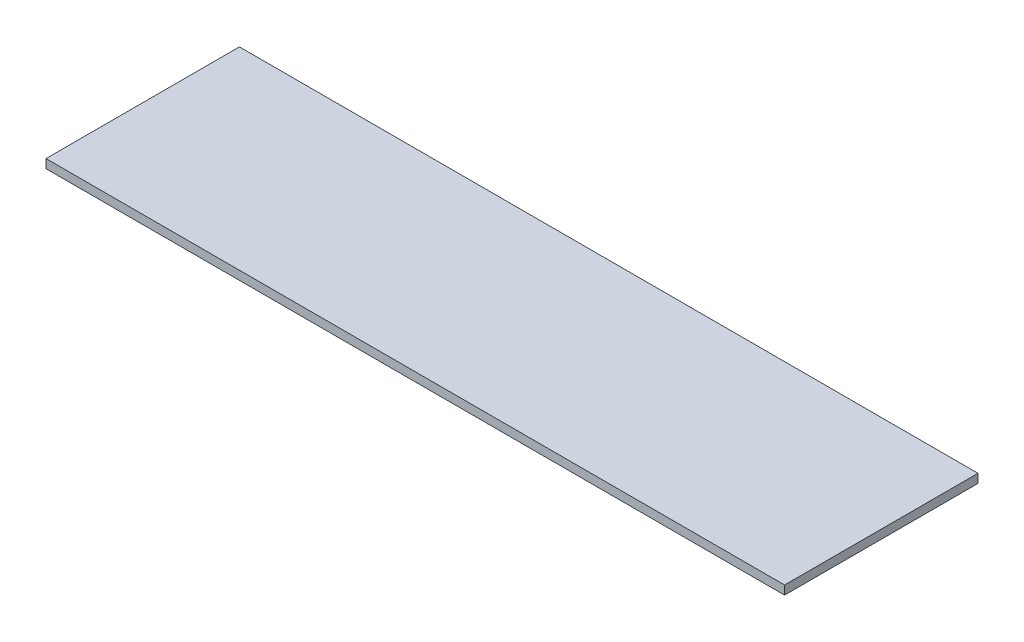
ISO-10303-21;
HEADER;
FILE_DESCRIPTION(('STEP AP214'),'2;1');
FILE_NAME('part.step','',(''),(''),'','','');
FILE_SCHEMA(('AUTOMOTIVE_DESIGN { 1 0 10303 214 1 1 1 1 }'));
ENDSEC;
DATA;
#1=APPLICATION_CONTEXT('core data for automotive mechanical design processes');
#2=APPLICATION_PROTOCOL_DEFINITION('international standard','automotive_design',2000,#1);
#3=PRODUCT_CONTEXT('',#1,'mechanical');
#4=PRODUCT('Part','Part','',(#3));
#5=PRODUCT_RELATED_PRODUCT_CATEGORY('part','',(#4));
#6=PRODUCT_DEFINITION_FORMATION('','',#4);
#7=PRODUCT_DEFINITION_CONTEXT('part definition',#1,'design');
#8=PRODUCT_DEFINITION('design','',#6,#7);
#9=PRODUCT_DEFINITION_SHAPE('','',#8);
#10=(LENGTH_UNIT() NAMED_UNIT(*) SI_UNIT(.MILLI.,.METRE.));
#11=(NAMED_UNIT(*) PLANE_ANGLE_UNIT() SI_UNIT($,.RADIAN.));
#12=(NAMED_UNIT(*) SI_UNIT($,.STERADIAN.) SOLID_ANGLE_UNIT());
#13=UNCERTAINTY_MEASURE_WITH_UNIT(LENGTH_MEASURE(1.E-05),#10,'distance_accuracy_value','');
#14=(GEOMETRIC_REPRESENTATION_CONTEXT(3) GLOBAL_UNCERTAINTY_ASSIGNED_CONTEXT((#13)) GLOBAL_UNIT_ASSIGNED_CONTEXT((#10,
#11,#12)) REPRESENTATION_CONTEXT('',''));
#15=CARTESIAN_POINT('',(0.,0.,0.));
#16=DIRECTION('',(0.,0.,1.));
#17=DIRECTION('',(1.,0.,0.));
#18=AXIS2_PLACEMENT_3D('',#15,#16,#17);
#19=CARTESIAN_POINT('',(0.,1.5875,-34.925));
#20=DIRECTION('',(1.,0.,0.));
#21=DIRECTION('',(0.,0.,-1.));
#22=AXIS2_PLACEMENT_3D('',#19,#20,#21);
#23=PLANE('',#22);
#24=DIRECTION('',(0.,0.,1.));
#25=VECTOR('',#24,1.);
#26=CARTESIAN_POINT('',(0.,0.,-34.925));
#27=LINE('',#26,#25);
#28=CARTESIAN_POINT('',(0.,0.,-34.925));
#29=VERTEX_POINT('',#28);
#30=CARTESIAN_POINT('',(0.,0.,0.));
#31=VERTEX_POINT('',#30);
#32=EDGE_CURVE('E105',#29,#31,#27,.T.);
#33=ORIENTED_EDGE('',*,*,#32,.T.);
#34=DIRECTION('',(0.,-1.,0.));
#35=VECTOR('',#34,1.);
#36=CARTESIAN_POINT('',(0.,1.5875,0.));
#37=LINE('',#36,#35);
#38=CARTESIAN_POINT('',(0.,1.5875,0.));
#39=VERTEX_POINT('',#38);
#40=EDGE_CURVE('E11',#39,#31,#37,.T.);
#41=ORIENTED_EDGE('',*,*,#40,.F.);
#42=DIRECTION('',(0.,0.,1.));
#43=VECTOR('',#42,1.);
#44=CARTESIAN_POINT('',(0.,1.5875,-34.925));
#45=LINE('',#44,#43);
#46=CARTESIAN_POINT('',(0.,1.5875,-34.925));
#47=VERTEX_POINT('',#46);
#48=EDGE_CURVE('E89',#47,#39,#45,.T.);
#49=ORIENTED_EDGE('',*,*,#48,.F.);
#50=DIRECTION('',(0.,-1.,0.));
#51=VECTOR('',#50,1.);
#52=CARTESIAN_POINT('',(0.,1.5875,-34.925));
#53=LINE('',#52,#51);
#54=EDGE_CURVE('E97',#47,#29,#53,.T.);
#55=ORIENTED_EDGE('',*,*,#54,.T.);
#56=EDGE_LOOP('',(#33,#41,#49,#55));
#57=FACE_BOUND('',#56,.T.);
#58=ADVANCED_FACE('F39',(#57),#23,.F.);
#59=CARTESIAN_POINT('',(0.,1.5875,0.));
#60=DIRECTION('',(0.,0.,-1.));
#61=DIRECTION('',(-1.,0.,0.));
#62=AXIS2_PLACEMENT_3D('',#59,#60,#61);
#63=PLANE('',#62);
#64=DIRECTION('',(1.,0.,0.));
#65=VECTOR('',#64,1.);
#66=CARTESIAN_POINT('',(0.,0.,0.));
#67=LINE('',#66,#65);
#68=CARTESIAN_POINT('',(133.35,0.,0.));
#69=VERTEX_POINT('',#68);
#70=EDGE_CURVE('E92',#31,#69,#67,.T.);
#71=ORIENTED_EDGE('',*,*,#70,.T.);
#72=DIRECTION('',(0.,-1.,0.));
#73=VECTOR('',#72,1.);
#74=CARTESIAN_POINT('',(133.35,1.5875,0.));
#75=LINE('',#74,#73);
#76=CARTESIAN_POINT('',(133.35,1.5875,0.));
#77=VERTEX_POINT('',#76);
#78=EDGE_CURVE('E50',#77,#69,#75,.T.);
#79=ORIENTED_EDGE('',*,*,#78,.F.);
#80=DIRECTION('',(1.,0.,0.));
#81=VECTOR('',#80,1.);
#82=CARTESIAN_POINT('',(0.,1.5875,0.));
#83=LINE('',#82,#81);
#84=EDGE_CURVE('E82',#39,#77,#83,.T.);
#85=ORIENTED_EDGE('',*,*,#84,.F.);
#86=ORIENTED_EDGE('',*,*,#40,.T.);
#87=EDGE_LOOP('',(#71,#79,#85,#86));
#88=FACE_BOUND('',#87,.T.);
#89=ADVANCED_FACE('F93',(#88),#63,.F.);
#90=CARTESIAN_POINT('',(133.35,1.5875,0.));
#91=DIRECTION('',(-1.,0.,0.));
#92=DIRECTION('',(0.,0.,1.));
#93=AXIS2_PLACEMENT_3D('',#90,#91,#92);
#94=PLANE('',#93);
#95=DIRECTION('',(0.,0.,-1.));
#96=VECTOR('',#95,1.);
#97=CARTESIAN_POINT('',(133.35,0.,0.));
#98=LINE('',#97,#96);
#99=CARTESIAN_POINT('',(133.35,0.,-34.925));
#100=VERTEX_POINT('',#99);
#101=EDGE_CURVE('E72',#69,#100,#98,.T.);
#102=ORIENTED_EDGE('',*,*,#101,.T.);
#103=DIRECTION('',(0.,-1.,0.));
#104=VECTOR('',#103,1.);
#105=CARTESIAN_POINT('',(133.35,1.5875,-34.925));
#106=LINE('',#105,#104);
#107=CARTESIAN_POINT('',(133.35,1.5875,-34.925));
#108=VERTEX_POINT('',#107);
#109=EDGE_CURVE('E94',#108,#100,#106,.T.);
#110=ORIENTED_EDGE('',*,*,#109,.F.);
#111=DIRECTION('',(0.,0.,-1.));
#112=VECTOR('',#111,1.);
#113=CARTESIAN_POINT('',(133.35,1.5875,0.));
#114=LINE('',#113,#112);
#115=EDGE_CURVE('E88',#77,#108,#114,.T.);
#116=ORIENTED_EDGE('',*,*,#115,.F.);
#117=ORIENTED_EDGE('',*,*,#78,.T.);
#118=EDGE_LOOP('',(#102,#110,#116,#117));
#119=FACE_BOUND('',#118,.T.);
#120=ADVANCED_FACE('F96',(#119),#94,.F.);
#121=CARTESIAN_POINT('',(133.35,1.5875,-34.925));
#122=DIRECTION('',(0.,0.,1.));
#123=DIRECTION('',(1.,0.,0.));
#124=AXIS2_PLACEMENT_3D('',#121,#122,#123);
#125=PLANE('',#124);
#126=DIRECTION('',(-1.,0.,0.));
#127=VECTOR('',#126,1.);
#128=CARTESIAN_POINT('',(133.35,0.,-34.925));
#129=LINE('',#128,#127);
#130=EDGE_CURVE('E76',#100,#29,#129,.T.);
#131=ORIENTED_EDGE('',*,*,#130,.T.);
#132=ORIENTED_EDGE('',*,*,#54,.F.);
#133=DIRECTION('',(-1.,0.,0.));
#134=VECTOR('',#133,1.);
#135=CARTESIAN_POINT('',(133.35,1.5875,-34.925));
#136=LINE('',#135,#134);
#137=EDGE_CURVE('E54',#108,#47,#136,.T.);
#138=ORIENTED_EDGE('',*,*,#137,.F.);
#139=ORIENTED_EDGE('',*,*,#109,.T.);
#140=EDGE_LOOP('',(#131,#132,#138,#139));
#141=FACE_BOUND('',#140,.T.);
#142=ADVANCED_FACE('F108',(#141),#125,.F.);
#143=CARTESIAN_POINT('',(0.,1.5875,0.));
#144=DIRECTION('',(0.,1.,0.));
#145=DIRECTION('',(0.,0.,1.));
#146=AXIS2_PLACEMENT_3D('',#143,#144,#145);
#147=PLANE('',#146);
#148=ORIENTED_EDGE('',*,*,#48,.T.);
#149=ORIENTED_EDGE('',*,*,#84,.T.);
#150=ORIENTED_EDGE('',*,*,#115,.T.);
#151=ORIENTED_EDGE('',*,*,#137,.T.);
#152=EDGE_LOOP('',(#148,#149,#150,#151));
#153=FACE_BOUND('',#152,.T.);
#154=ADVANCED_FACE('F86',(#153),#147,.T.);
#155=CARTESIAN_POINT('',(0.,0.,0.));
#156=DIRECTION('',(0.,1.,0.));
#157=DIRECTION('',(0.,0.,1.));
#158=AXIS2_PLACEMENT_3D('',#155,#156,#157);
#159=PLANE('',#158);
#160=ORIENTED_EDGE('',*,*,#32,.F.);
#161=ORIENTED_EDGE('',*,*,#130,.F.);
#162=ORIENTED_EDGE('',*,*,#101,.F.);
#163=ORIENTED_EDGE('',*,*,#70,.F.);
#164=EDGE_LOOP('',(#160,#161,#162,#163));
#165=FACE_BOUND('',#164,.T.);
#166=ADVANCED_FACE('F115',(#165),#159,.F.);
#167=CLOSED_SHELL('',(#58,#89,#120,#142,#154,#166));
#168=MANIFOLD_SOLID_BREP('B2',#167);
#169=ADVANCED_BREP_SHAPE_REPRESENTATION('',(#18,#168),#14);
#170=SHAPE_DEFINITION_REPRESENTATION(#9,#169);
ENDSEC;
END-ISO-10303-21;
